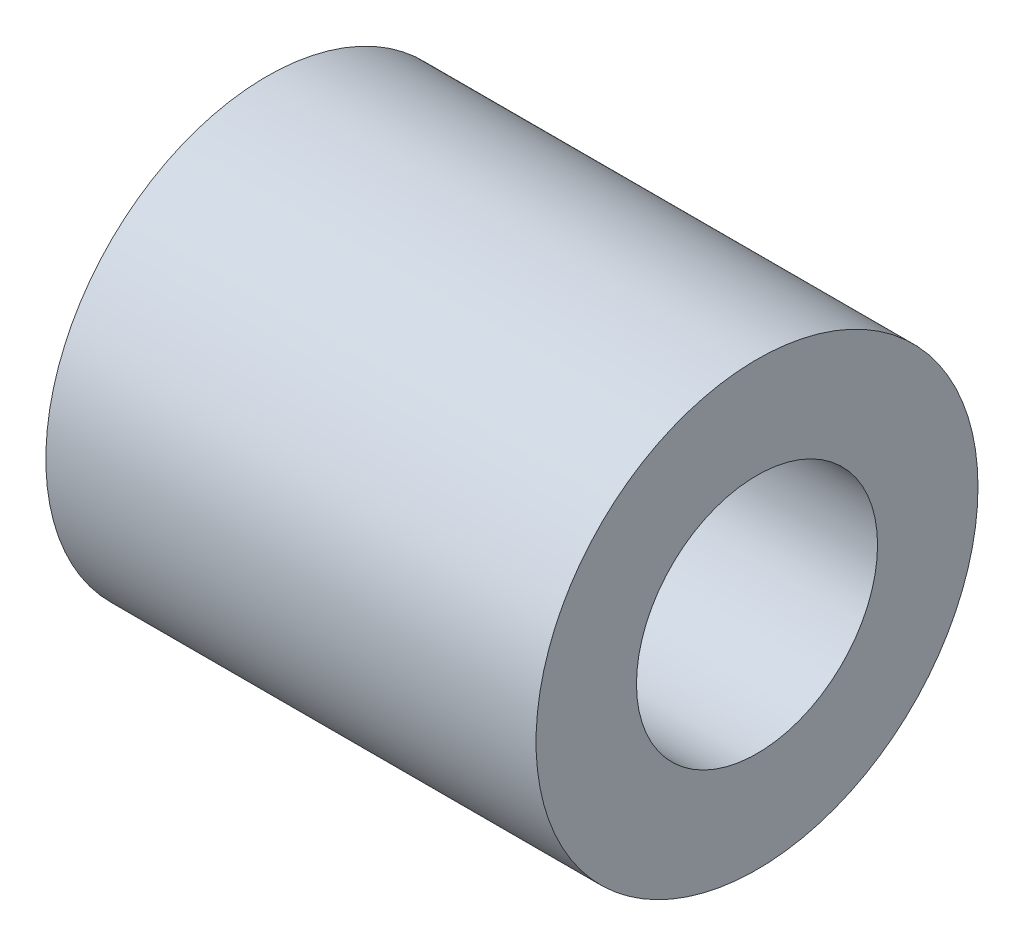
ISO-10303-21;
HEADER;
FILE_DESCRIPTION(('STEP AP214'),'2;1');
FILE_NAME('part.step','',(''),(''),'','','');
FILE_SCHEMA(('AUTOMOTIVE_DESIGN { 1 0 10303 214 1 1 1 1 }'));
ENDSEC;
DATA;
#1=APPLICATION_CONTEXT('core data for automotive mechanical design processes');
#2=APPLICATION_PROTOCOL_DEFINITION('international standard','automotive_design',2000,#1);
#3=PRODUCT_CONTEXT('',#1,'mechanical');
#4=PRODUCT('Part','Part','',(#3));
#5=PRODUCT_RELATED_PRODUCT_CATEGORY('part','',(#4));
#6=PRODUCT_DEFINITION_FORMATION('','',#4);
#7=PRODUCT_DEFINITION_CONTEXT('part definition',#1,'design');
#8=PRODUCT_DEFINITION('design','',#6,#7);
#9=PRODUCT_DEFINITION_SHAPE('','',#8);
#10=(LENGTH_UNIT() NAMED_UNIT(*) SI_UNIT(.MILLI.,.METRE.));
#11=(NAMED_UNIT(*) PLANE_ANGLE_UNIT() SI_UNIT($,.RADIAN.));
#12=(NAMED_UNIT(*) SI_UNIT($,.STERADIAN.) SOLID_ANGLE_UNIT());
#13=UNCERTAINTY_MEASURE_WITH_UNIT(LENGTH_MEASURE(1.E-05),#10,'distance_accuracy_value','');
#14=(GEOMETRIC_REPRESENTATION_CONTEXT(3) GLOBAL_UNCERTAINTY_ASSIGNED_CONTEXT((#13)) GLOBAL_UNIT_ASSIGNED_CONTEXT((#10,
#11,#12)) REPRESENTATION_CONTEXT('',''));
#15=CARTESIAN_POINT('',(0.,0.,0.));
#16=DIRECTION('',(0.,0.,1.));
#17=DIRECTION('',(1.,0.,0.));
#18=AXIS2_PLACEMENT_3D('',#15,#16,#17);
#19=CARTESIAN_POINT('',(12.2,0.,0.));
#20=DIRECTION('',(1.,0.,0.));
#21=DIRECTION('',(0.,0.,-1.));
#22=AXIS2_PLACEMENT_3D('',#19,#20,#21);
#23=PLANE('',#22);
#24=CARTESIAN_POINT('',(12.2,0.,0.));
#25=DIRECTION('',(1.,0.,0.));
#26=DIRECTION('',(0.,0.,-1.));
#27=AXIS2_PLACEMENT_3D('',#24,#25,#26);
#28=CIRCLE('',#27,5.5);
#29=CARTESIAN_POINT('',(12.2,0.,-5.5));
#30=VERTEX_POINT('',#29);
#31=EDGE_CURVE('E10',#30,#30,#28,.T.);
#32=ORIENTED_EDGE('',*,*,#31,.T.);
#33=EDGE_LOOP('',(#32));
#34=FACE_BOUND('',#33,.T.);
#35=CARTESIAN_POINT('',(12.2,0.,0.));
#36=DIRECTION('',(1.,0.,0.));
#37=DIRECTION('',(0.,0.,-1.));
#38=AXIS2_PLACEMENT_3D('',#35,#36,#37);
#39=CIRCLE('',#38,3.);
#40=CARTESIAN_POINT('',(12.2,0.,-3.));
#41=VERTEX_POINT('',#40);
#42=EDGE_CURVE('E44',#41,#41,#39,.T.);
#43=ORIENTED_EDGE('',*,*,#42,.F.);
#44=EDGE_LOOP('',(#43));
#45=FACE_BOUND('',#44,.T.);
#46=ADVANCED_FACE('F33',(#34,#45),#23,.T.);
#47=CARTESIAN_POINT('',(0.,0.,0.));
#48=DIRECTION('',(1.,0.,0.));
#49=DIRECTION('',(0.,0.,-1.));
#50=AXIS2_PLACEMENT_3D('',#47,#48,#49);
#51=PLANE('',#50);
#52=CARTESIAN_POINT('',(0.,0.,0.));
#53=DIRECTION('',(1.,0.,0.));
#54=DIRECTION('',(0.,0.,-1.));
#55=AXIS2_PLACEMENT_3D('',#52,#53,#54);
#56=CIRCLE('',#55,5.5);
#57=CARTESIAN_POINT('',(0.,0.,-5.5));
#58=VERTEX_POINT('',#57);
#59=EDGE_CURVE('E37',#58,#58,#56,.T.);
#60=ORIENTED_EDGE('',*,*,#59,.F.);
#61=EDGE_LOOP('',(#60));
#62=FACE_BOUND('',#61,.T.);
#63=CARTESIAN_POINT('',(0.,0.,0.));
#64=DIRECTION('',(1.,0.,0.));
#65=DIRECTION('',(0.,0.,-1.));
#66=AXIS2_PLACEMENT_3D('',#63,#64,#65);
#67=CIRCLE('',#66,3.);
#68=CARTESIAN_POINT('',(0.,0.,-3.));
#69=VERTEX_POINT('',#68);
#70=EDGE_CURVE('E46',#69,#69,#67,.T.);
#71=ORIENTED_EDGE('',*,*,#70,.T.);
#72=EDGE_LOOP('',(#71));
#73=FACE_BOUND('',#72,.T.);
#74=ADVANCED_FACE('F56',(#62,#73),#51,.F.);
#75=CARTESIAN_POINT('',(12.2,0.,0.));
#76=DIRECTION('',(-1.,0.,0.));
#77=DIRECTION('',(0.,0.,1.));
#78=AXIS2_PLACEMENT_3D('',#75,#76,#77);
#79=CYLINDRICAL_SURFACE('',#78,5.5);
#80=ORIENTED_EDGE('',*,*,#31,.F.);
#81=EDGE_LOOP('',(#80));
#82=FACE_BOUND('',#81,.T.);
#83=ORIENTED_EDGE('',*,*,#59,.T.);
#84=EDGE_LOOP('',(#83));
#85=FACE_BOUND('',#84,.T.);
#86=ADVANCED_FACE('F35',(#82,#85),#79,.T.);
#87=CARTESIAN_POINT('',(12.2,0.,0.));
#88=DIRECTION('',(-1.,0.,0.));
#89=DIRECTION('',(0.,0.,1.));
#90=AXIS2_PLACEMENT_3D('',#87,#88,#89);
#91=CYLINDRICAL_SURFACE('',#90,3.);
#92=ORIENTED_EDGE('',*,*,#42,.T.);
#93=EDGE_LOOP('',(#92));
#94=FACE_BOUND('',#93,.T.);
#95=ORIENTED_EDGE('',*,*,#70,.F.);
#96=EDGE_LOOP('',(#95));
#97=FACE_BOUND('',#96,.T.);
#98=ADVANCED_FACE('F52',(#94,#97),#91,.F.);
#99=CLOSED_SHELL('',(#46,#74,#86,#98));
#100=MANIFOLD_SOLID_BREP('B2',#99);
#101=ADVANCED_BREP_SHAPE_REPRESENTATION('',(#18,#100),#14);
#102=SHAPE_DEFINITION_REPRESENTATION(#9,#101);
ENDSEC;
END-ISO-10303-21;
